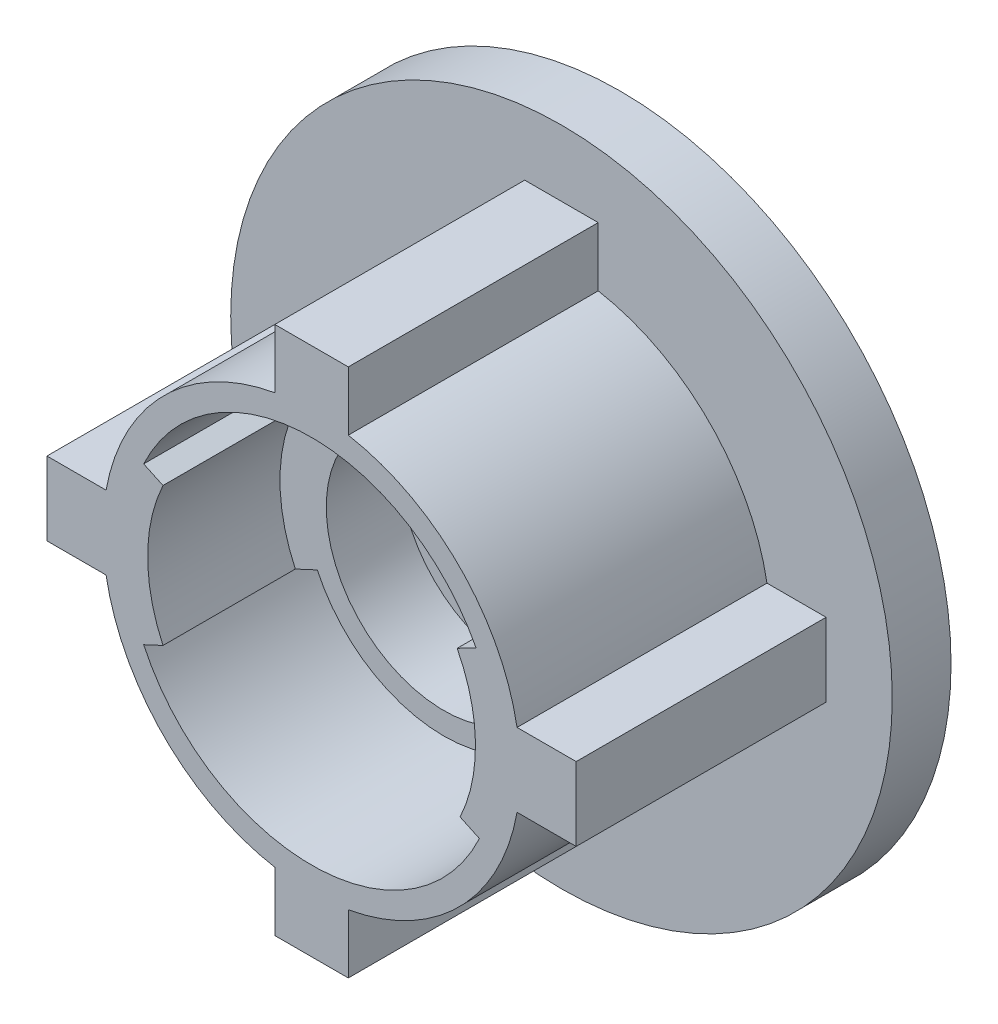
ISO-10303-21;
HEADER;
FILE_DESCRIPTION(('STEP AP214'),'2;1');
FILE_NAME('part.step','',(''),(''),'','','');
FILE_SCHEMA(('AUTOMOTIVE_DESIGN { 1 0 10303 214 1 1 1 1 }'));
ENDSEC;
DATA;
#1=APPLICATION_CONTEXT('core data for automotive mechanical design processes');
#2=APPLICATION_PROTOCOL_DEFINITION('international standard','automotive_design',2000,#1);
#3=PRODUCT_CONTEXT('',#1,'mechanical');
#4=PRODUCT('Part','Part','',(#3));
#5=PRODUCT_RELATED_PRODUCT_CATEGORY('part','',(#4));
#6=PRODUCT_DEFINITION_FORMATION('','',#4);
#7=PRODUCT_DEFINITION_CONTEXT('part definition',#1,'design');
#8=PRODUCT_DEFINITION('design','',#6,#7);
#9=PRODUCT_DEFINITION_SHAPE('','',#8);
#10=(LENGTH_UNIT() NAMED_UNIT(*) SI_UNIT(.MILLI.,.METRE.));
#11=(NAMED_UNIT(*) PLANE_ANGLE_UNIT() SI_UNIT($,.RADIAN.));
#12=(NAMED_UNIT(*) SI_UNIT($,.STERADIAN.) SOLID_ANGLE_UNIT());
#13=UNCERTAINTY_MEASURE_WITH_UNIT(LENGTH_MEASURE(1.E-05),#10,'distance_accuracy_value','');
#14=(GEOMETRIC_REPRESENTATION_CONTEXT(3) GLOBAL_UNCERTAINTY_ASSIGNED_CONTEXT((#13)) GLOBAL_UNIT_ASSIGNED_CONTEXT((#10,
#11,#12)) REPRESENTATION_CONTEXT('',''));
#15=CARTESIAN_POINT('',(0.,0.,0.));
#16=DIRECTION('',(0.,0.,1.));
#17=DIRECTION('',(1.,0.,0.));
#18=AXIS2_PLACEMENT_3D('',#15,#16,#17);
#19=CARTESIAN_POINT('',(0.,0.,7.));
#20=DIRECTION('',(0.,0.,1.));
#21=DIRECTION('',(1.,0.,0.));
#22=AXIS2_PLACEMENT_3D('',#19,#20,#21);
#23=CYLINDRICAL_SURFACE('',#22,8.);
#24=CARTESIAN_POINT('',(0.,0.,3.));
#25=DIRECTION('',(0.,0.,-1.));
#26=DIRECTION('',(-1.,0.,0.));
#27=AXIS2_PLACEMENT_3D('',#24,#25,#26);
#28=CIRCLE('',#27,8.);
#29=CARTESIAN_POINT('',(-8.,0.,3.));
#30=VERTEX_POINT('',#29);
#31=EDGE_CURVE('E409',#30,#30,#28,.T.);
#32=ORIENTED_EDGE('',*,*,#31,.T.);
#33=EDGE_LOOP('',(#32));
#34=FACE_BOUND('',#33,.T.);
#35=CARTESIAN_POINT('',(0.,0.,8.));
#36=DIRECTION('',(0.,0.,1.));
#37=DIRECTION('',(1.,0.,0.));
#38=AXIS2_PLACEMENT_3D('',#35,#36,#37);
#39=CIRCLE('',#38,8.);
#40=CARTESIAN_POINT('',(8.,0.,8.));
#41=VERTEX_POINT('',#40);
#42=EDGE_CURVE('E362',#41,#41,#39,.F.);
#43=ORIENTED_EDGE('',*,*,#42,.F.);
#44=EDGE_LOOP('',(#43));
#45=FACE_BOUND('',#44,.T.);
#46=ADVANCED_FACE('F49',(#34,#45),#23,.F.);
#47=CARTESIAN_POINT('',(0.,0.,8.));
#48=DIRECTION('',(0.,0.,1.));
#49=DIRECTION('',(1.,0.,0.));
#50=AXIS2_PLACEMENT_3D('',#47,#48,#49);
#51=CYLINDRICAL_SURFACE('',#50,9.5);
#52=CARTESIAN_POINT('',(0.,0.,8.));
#53=DIRECTION('',(0.,0.,1.));
#54=DIRECTION('',(1.,0.,0.));
#55=AXIS2_PLACEMENT_3D('',#52,#53,#54);
#56=CIRCLE('',#55,9.5);
#57=CARTESIAN_POINT('',(-8.60992397684817,-4.01487348653666,8.));
#58=VERTEX_POINT('',#57);
#59=CARTESIAN_POINT('',(8.60992397684817,-4.01487348653666,8.));
#60=VERTEX_POINT('',#59);
#61=EDGE_CURVE('E352',#58,#60,#56,.T.);
#62=ORIENTED_EDGE('',*,*,#61,.F.);
#63=DIRECTION('',(0.,0.,1.));
#64=VECTOR('',#63,1.);
#65=CARTESIAN_POINT('',(-8.60992397684817,-4.01487348653666,-24.1856365171545));
#66=LINE('',#65,#64);
#67=CARTESIAN_POINT('',(-8.60992397684817,-4.01487348653666,3.));
#68=VERTEX_POINT('',#67);
#69=EDGE_CURVE('E374',#68,#58,#66,.T.);
#70=ORIENTED_EDGE('',*,*,#69,.F.);
#71=CARTESIAN_POINT('',(0.,0.,3.));
#72=DIRECTION('',(0.,0.,-1.));
#73=DIRECTION('',(-1.,0.,0.));
#74=AXIS2_PLACEMENT_3D('',#71,#72,#73);
#75=CIRCLE('',#74,9.5);
#76=CARTESIAN_POINT('',(8.60992397684817,-4.01487348653666,3.));
#77=VERTEX_POINT('',#76);
#78=EDGE_CURVE('E517',#68,#77,#75,.F.);
#79=ORIENTED_EDGE('',*,*,#78,.T.);
#80=DIRECTION('',(0.,0.,1.));
#81=VECTOR('',#80,1.);
#82=CARTESIAN_POINT('',(8.60992397684817,-4.01487348653666,8.));
#83=LINE('',#82,#81);
#84=EDGE_CURVE('E406',#77,#60,#83,.T.);
#85=ORIENTED_EDGE('',*,*,#84,.T.);
#86=EDGE_LOOP('',(#62,#70,#79,#85));
#87=FACE_BOUND('',#86,.T.);
#88=ADVANCED_FACE('F533',(#87),#51,.T.);
#89=CARTESIAN_POINT('',(0.,0.,8.));
#90=DIRECTION('',(0.,0.,1.));
#91=DIRECTION('',(1.,0.,0.));
#92=AXIS2_PLACEMENT_3D('',#89,#90,#91);
#93=CYLINDRICAL_SURFACE('',#92,9.5);
#94=CARTESIAN_POINT('',(0.,0.,8.));
#95=DIRECTION('',(0.,0.,1.));
#96=DIRECTION('',(1.,0.,0.));
#97=AXIS2_PLACEMENT_3D('',#94,#95,#96);
#98=CIRCLE('',#97,9.5);
#99=CARTESIAN_POINT('',(8.43777370372536,4.36508590118464,8.));
#100=VERTEX_POINT('',#99);
#101=CARTESIAN_POINT('',(-8.60992397684817,4.01487348653666,8.));
#102=VERTEX_POINT('',#101);
#103=EDGE_CURVE('E358',#100,#102,#98,.T.);
#104=ORIENTED_EDGE('',*,*,#103,.F.);
#105=DIRECTION('',(0.,0.,1.));
#106=VECTOR('',#105,1.);
#107=CARTESIAN_POINT('',(8.43777370372536,4.36508590118464,8.));
#108=LINE('',#107,#106);
#109=CARTESIAN_POINT('',(8.43777370372536,4.36508590118464,3.));
#110=VERTEX_POINT('',#109);
#111=EDGE_CURVE('E410',#110,#100,#108,.T.);
#112=ORIENTED_EDGE('',*,*,#111,.F.);
#113=CARTESIAN_POINT('',(0.,0.,3.));
#114=DIRECTION('',(0.,0.,-1.));
#115=DIRECTION('',(-1.,0.,0.));
#116=AXIS2_PLACEMENT_3D('',#113,#114,#115);
#117=CIRCLE('',#116,9.5);
#118=CARTESIAN_POINT('',(-8.60992397684817,4.01487348653666,3.));
#119=VERTEX_POINT('',#118);
#120=EDGE_CURVE('E511',#110,#119,#117,.F.);
#121=ORIENTED_EDGE('',*,*,#120,.T.);
#122=DIRECTION('',(0.,0.,1.));
#123=VECTOR('',#122,1.);
#124=CARTESIAN_POINT('',(-8.60992397684817,4.01487348653666,8.));
#125=LINE('',#124,#123);
#126=EDGE_CURVE('E413',#119,#102,#125,.T.);
#127=ORIENTED_EDGE('',*,*,#126,.T.);
#128=EDGE_LOOP('',(#104,#112,#121,#127));
#129=FACE_BOUND('',#128,.T.);
#130=ADVANCED_FACE('F568',(#129),#93,.T.);
#131=CARTESIAN_POINT('',(-2.50000000000001,0.,15.));
#132=DIRECTION('',(1.,0.,0.));
#133=DIRECTION('',(0.,0.,-1.));
#134=AXIS2_PLACEMENT_3D('',#131,#132,#133);
#135=PLANE('',#134);
#136=DIRECTION('',(0.,0.,-1.));
#137=VECTOR('',#136,1.);
#138=CARTESIAN_POINT('',(-2.50000000000001,13.9781973086661,15.));
#139=LINE('',#138,#137);
#140=CARTESIAN_POINT('',(-2.5,13.9781973086661,17.));
#141=VERTEX_POINT('',#140);
#142=CARTESIAN_POINT('',(-2.50000000000001,13.9781973086661,0.));
#143=VERTEX_POINT('',#142);
#144=EDGE_CURVE('E495',#141,#143,#139,.T.);
#145=ORIENTED_EDGE('',*,*,#144,.F.);
#146=DIRECTION('',(0.,-1.,0.));
#147=VECTOR('',#146,1.);
#148=CARTESIAN_POINT('',(-2.50000000000001,0.,17.));
#149=LINE('',#148,#147);
#150=CARTESIAN_POINT('',(-2.50000000000001,18.,17.));
#151=VERTEX_POINT('',#150);
#152=EDGE_CURVE('E278',#151,#141,#149,.T.);
#153=ORIENTED_EDGE('',*,*,#152,.F.);
#154=DIRECTION('',(0.,0.,-1.));
#155=VECTOR('',#154,1.);
#156=CARTESIAN_POINT('',(-2.50000000000001,18.,15.));
#157=LINE('',#156,#155);
#158=CARTESIAN_POINT('',(-2.50000000000001,18.,0.));
#159=VERTEX_POINT('',#158);
#160=EDGE_CURVE('E270',#151,#159,#157,.T.);
#161=ORIENTED_EDGE('',*,*,#160,.T.);
#162=DIRECTION('',(0.,-1.,0.));
#163=VECTOR('',#162,1.);
#164=CARTESIAN_POINT('',(-2.50000000000001,0.,0.));
#165=LINE('',#164,#163);
#166=EDGE_CURVE('E424',#159,#143,#165,.T.);
#167=ORIENTED_EDGE('',*,*,#166,.T.);
#168=EDGE_LOOP('',(#145,#153,#161,#167));
#169=FACE_BOUND('',#168,.T.);
#170=ADVANCED_FACE('F666',(#169),#135,.F.);
#171=CARTESIAN_POINT('',(0.,0.,15.));
#172=DIRECTION('',(0.,0.,-1.));
#173=DIRECTION('',(-1.,0.,0.));
#174=AXIS2_PLACEMENT_3D('',#171,#172,#173);
#175=CYLINDRICAL_SURFACE('',#174,14.2);
#176=DIRECTION('',(0.,0.,-1.));
#177=VECTOR('',#176,1.);
#178=CARTESIAN_POINT('',(-13.9781973086661,2.49999999999995,15.));
#179=LINE('',#178,#177);
#180=CARTESIAN_POINT('',(-13.9781973086661,2.49999999999996,17.));
#181=VERTEX_POINT('',#180);
#182=CARTESIAN_POINT('',(-13.9781973086661,2.49999999999995,0.));
#183=VERTEX_POINT('',#182);
#184=EDGE_CURVE('E493',#181,#183,#179,.T.);
#185=ORIENTED_EDGE('',*,*,#184,.F.);
#186=CARTESIAN_POINT('',(0.,0.,17.));
#187=DIRECTION('',(0.,0.,1.));
#188=DIRECTION('',(1.,0.,0.));
#189=AXIS2_PLACEMENT_3D('',#186,#187,#188);
#190=CIRCLE('',#189,14.2);
#191=EDGE_CURVE('E289',#141,#181,#190,.T.);
#192=ORIENTED_EDGE('',*,*,#191,.F.);
#193=ORIENTED_EDGE('',*,*,#144,.T.);
#194=CARTESIAN_POINT('',(0.,0.,0.));
#195=DIRECTION('',(0.,0.,1.));
#196=DIRECTION('',(1.,0.,0.));
#197=AXIS2_PLACEMENT_3D('',#194,#195,#196);
#198=CIRCLE('',#197,14.2);
#199=EDGE_CURVE('E427',#143,#183,#198,.T.);
#200=ORIENTED_EDGE('',*,*,#199,.T.);
#201=EDGE_LOOP('',(#185,#192,#193,#200));
#202=FACE_BOUND('',#201,.T.);
#203=ADVANCED_FACE('F662',(#202),#175,.T.);
#204=CARTESIAN_POINT('',(0.,2.49999999999995,15.));
#205=DIRECTION('',(0.,-1.,0.));
#206=DIRECTION('',(0.,0.,-1.));
#207=AXIS2_PLACEMENT_3D('',#204,#205,#206);
#208=PLANE('',#207);
#209=DIRECTION('',(0.,0.,-1.));
#210=VECTOR('',#209,1.);
#211=CARTESIAN_POINT('',(-18.,2.49999999999995,15.));
#212=LINE('',#211,#210);
#213=CARTESIAN_POINT('',(-18.,2.49999999999995,17.));
#214=VERTEX_POINT('',#213);
#215=CARTESIAN_POINT('',(-18.,2.49999999999995,0.));
#216=VERTEX_POINT('',#215);
#217=EDGE_CURVE('E491',#214,#216,#212,.T.);
#218=ORIENTED_EDGE('',*,*,#217,.F.);
#219=DIRECTION('',(-1.,0.,0.));
#220=VECTOR('',#219,1.);
#221=CARTESIAN_POINT('',(0.,2.49999999999997,17.));
#222=LINE('',#221,#220);
#223=EDGE_CURVE('E292',#181,#214,#222,.T.);
#224=ORIENTED_EDGE('',*,*,#223,.F.);
#225=ORIENTED_EDGE('',*,*,#184,.T.);
#226=DIRECTION('',(-1.,0.,0.));
#227=VECTOR('',#226,1.);
#228=CARTESIAN_POINT('',(0.,2.49999999999995,0.));
#229=LINE('',#228,#227);
#230=EDGE_CURVE('E430',#183,#216,#229,.T.);
#231=ORIENTED_EDGE('',*,*,#230,.T.);
#232=EDGE_LOOP('',(#218,#224,#225,#231));
#233=FACE_BOUND('',#232,.T.);
#234=ADVANCED_FACE('F658',(#233),#208,.F.);
#235=CARTESIAN_POINT('',(-18.,0.,15.));
#236=DIRECTION('',(1.,0.,0.));
#237=DIRECTION('',(0.,0.,-1.));
#238=AXIS2_PLACEMENT_3D('',#235,#236,#237);
#239=PLANE('',#238);
#240=DIRECTION('',(0.,0.,-1.));
#241=VECTOR('',#240,1.);
#242=CARTESIAN_POINT('',(-18.,-2.5,15.));
#243=LINE('',#242,#241);
#244=CARTESIAN_POINT('',(-18.,-2.5,17.));
#245=VERTEX_POINT('',#244);
#246=CARTESIAN_POINT('',(-18.,-2.5,0.));
#247=VERTEX_POINT('',#246);
#248=EDGE_CURVE('E489',#245,#247,#243,.T.);
#249=ORIENTED_EDGE('',*,*,#248,.F.);
#250=DIRECTION('',(0.,-1.,0.));
#251=VECTOR('',#250,1.);
#252=CARTESIAN_POINT('',(-18.,0.,17.));
#253=LINE('',#252,#251);
#254=EDGE_CURVE('E295',#214,#245,#253,.T.);
#255=ORIENTED_EDGE('',*,*,#254,.F.);
#256=ORIENTED_EDGE('',*,*,#217,.T.);
#257=DIRECTION('',(0.,-1.,0.));
#258=VECTOR('',#257,1.);
#259=CARTESIAN_POINT('',(-18.,0.,0.));
#260=LINE('',#259,#258);
#261=EDGE_CURVE('E433',#216,#247,#260,.T.);
#262=ORIENTED_EDGE('',*,*,#261,.T.);
#263=EDGE_LOOP('',(#249,#255,#256,#262));
#264=FACE_BOUND('',#263,.T.);
#265=ADVANCED_FACE('F654',(#264),#239,.F.);
#266=CARTESIAN_POINT('',(0.,-2.5,15.));
#267=DIRECTION('',(0.,1.,0.));
#268=DIRECTION('',(0.,0.,1.));
#269=AXIS2_PLACEMENT_3D('',#266,#267,#268);
#270=PLANE('',#269);
#271=DIRECTION('',(0.,0.,-1.));
#272=VECTOR('',#271,1.);
#273=CARTESIAN_POINT('',(-13.9781973086661,-2.5,15.));
#274=LINE('',#273,#272);
#275=CARTESIAN_POINT('',(-13.9781973086661,-2.5,17.));
#276=VERTEX_POINT('',#275);
#277=CARTESIAN_POINT('',(-13.9781973086661,-2.5,0.));
#278=VERTEX_POINT('',#277);
#279=EDGE_CURVE('E487',#276,#278,#274,.T.);
#280=ORIENTED_EDGE('',*,*,#279,.F.);
#281=DIRECTION('',(1.,0.,0.));
#282=VECTOR('',#281,1.);
#283=CARTESIAN_POINT('',(0.,-2.5,17.));
#284=LINE('',#283,#282);
#285=EDGE_CURVE('E298',#245,#276,#284,.T.);
#286=ORIENTED_EDGE('',*,*,#285,.F.);
#287=ORIENTED_EDGE('',*,*,#248,.T.);
#288=DIRECTION('',(1.,0.,0.));
#289=VECTOR('',#288,1.);
#290=CARTESIAN_POINT('',(0.,-2.5,0.));
#291=LINE('',#290,#289);
#292=EDGE_CURVE('E436',#247,#278,#291,.T.);
#293=ORIENTED_EDGE('',*,*,#292,.T.);
#294=EDGE_LOOP('',(#280,#286,#287,#293));
#295=FACE_BOUND('',#294,.T.);
#296=ADVANCED_FACE('F650',(#295),#270,.F.);
#297=CARTESIAN_POINT('',(0.,0.,15.));
#298=DIRECTION('',(0.,0.,-1.));
#299=DIRECTION('',(-1.,0.,0.));
#300=AXIS2_PLACEMENT_3D('',#297,#298,#299);
#301=CYLINDRICAL_SURFACE('',#300,14.2);
#302=DIRECTION('',(0.,0.,-1.));
#303=VECTOR('',#302,1.);
#304=CARTESIAN_POINT('',(-2.5,-13.9781973086661,15.));
#305=LINE('',#304,#303);
#306=CARTESIAN_POINT('',(-2.50000000000001,-13.9781973086661,17.));
#307=VERTEX_POINT('',#306);
#308=CARTESIAN_POINT('',(-2.5,-13.9781973086661,0.));
#309=VERTEX_POINT('',#308);
#310=EDGE_CURVE('E485',#307,#309,#305,.T.);
#311=ORIENTED_EDGE('',*,*,#310,.F.);
#312=CARTESIAN_POINT('',(0.,0.,17.));
#313=DIRECTION('',(0.,0.,1.));
#314=DIRECTION('',(1.,0.,0.));
#315=AXIS2_PLACEMENT_3D('',#312,#313,#314);
#316=CIRCLE('',#315,14.2);
#317=EDGE_CURVE('E301',#276,#307,#316,.T.);
#318=ORIENTED_EDGE('',*,*,#317,.F.);
#319=ORIENTED_EDGE('',*,*,#279,.T.);
#320=CARTESIAN_POINT('',(0.,0.,0.));
#321=DIRECTION('',(0.,0.,1.));
#322=DIRECTION('',(1.,0.,0.));
#323=AXIS2_PLACEMENT_3D('',#320,#321,#322);
#324=CIRCLE('',#323,14.2);
#325=EDGE_CURVE('E439',#278,#309,#324,.T.);
#326=ORIENTED_EDGE('',*,*,#325,.T.);
#327=EDGE_LOOP('',(#311,#318,#319,#326));
#328=FACE_BOUND('',#327,.T.);
#329=ADVANCED_FACE('F646',(#328),#301,.T.);
#330=CARTESIAN_POINT('',(-2.5,0.,15.));
#331=DIRECTION('',(1.,0.,0.));
#332=DIRECTION('',(0.,0.,-1.));
#333=AXIS2_PLACEMENT_3D('',#330,#331,#332);
#334=PLANE('',#333);
#335=DIRECTION('',(0.,0.,-1.));
#336=VECTOR('',#335,1.);
#337=CARTESIAN_POINT('',(-2.5,-18.,15.));
#338=LINE('',#337,#336);
#339=CARTESIAN_POINT('',(-2.5,-18.,17.));
#340=VERTEX_POINT('',#339);
#341=CARTESIAN_POINT('',(-2.5,-18.,0.));
#342=VERTEX_POINT('',#341);
#343=EDGE_CURVE('E483',#340,#342,#338,.T.);
#344=ORIENTED_EDGE('',*,*,#343,.F.);
#345=DIRECTION('',(0.,-1.,0.));
#346=VECTOR('',#345,1.);
#347=CARTESIAN_POINT('',(-2.50000000000003,0.,17.));
#348=LINE('',#347,#346);
#349=EDGE_CURVE('E304',#307,#340,#348,.T.);
#350=ORIENTED_EDGE('',*,*,#349,.F.);
#351=ORIENTED_EDGE('',*,*,#310,.T.);
#352=DIRECTION('',(0.,-1.,0.));
#353=VECTOR('',#352,1.);
#354=CARTESIAN_POINT('',(-2.5,0.,0.));
#355=LINE('',#354,#353);
#356=EDGE_CURVE('E442',#309,#342,#355,.T.);
#357=ORIENTED_EDGE('',*,*,#356,.T.);
#358=EDGE_LOOP('',(#344,#350,#351,#357));
#359=FACE_BOUND('',#358,.T.);
#360=ADVANCED_FACE('F642',(#359),#334,.F.);
#361=CARTESIAN_POINT('',(0.,-18.,15.));
#362=DIRECTION('',(0.,1.,0.));
#363=DIRECTION('',(0.,0.,1.));
#364=AXIS2_PLACEMENT_3D('',#361,#362,#363);
#365=PLANE('',#364);
#366=DIRECTION('',(0.,0.,-1.));
#367=VECTOR('',#366,1.);
#368=CARTESIAN_POINT('',(2.5,-18.,15.));
#369=LINE('',#368,#367);
#370=CARTESIAN_POINT('',(2.5,-18.,17.));
#371=VERTEX_POINT('',#370);
#372=CARTESIAN_POINT('',(2.5,-18.,0.));
#373=VERTEX_POINT('',#372);
#374=EDGE_CURVE('E481',#371,#373,#369,.T.);
#375=ORIENTED_EDGE('',*,*,#374,.F.);
#376=DIRECTION('',(1.,0.,0.));
#377=VECTOR('',#376,1.);
#378=CARTESIAN_POINT('',(0.,-18.,17.));
#379=LINE('',#378,#377);
#380=EDGE_CURVE('E307',#340,#371,#379,.T.);
#381=ORIENTED_EDGE('',*,*,#380,.F.);
#382=ORIENTED_EDGE('',*,*,#343,.T.);
#383=DIRECTION('',(1.,0.,0.));
#384=VECTOR('',#383,1.);
#385=CARTESIAN_POINT('',(0.,-18.,0.));
#386=LINE('',#385,#384);
#387=EDGE_CURVE('E445',#342,#373,#386,.T.);
#388=ORIENTED_EDGE('',*,*,#387,.T.);
#389=EDGE_LOOP('',(#375,#381,#382,#388));
#390=FACE_BOUND('',#389,.T.);
#391=ADVANCED_FACE('F638',(#390),#365,.F.);
#392=CARTESIAN_POINT('',(2.5,0.,15.));
#393=DIRECTION('',(-1.,0.,0.));
#394=DIRECTION('',(0.,0.,1.));
#395=AXIS2_PLACEMENT_3D('',#392,#393,#394);
#396=PLANE('',#395);
#397=DIRECTION('',(0.,0.,-1.));
#398=VECTOR('',#397,1.);
#399=CARTESIAN_POINT('',(2.5,-13.9781973086661,15.));
#400=LINE('',#399,#398);
#401=CARTESIAN_POINT('',(2.5,-13.9781973086661,17.));
#402=VERTEX_POINT('',#401);
#403=CARTESIAN_POINT('',(2.5,-13.9781973086661,0.));
#404=VERTEX_POINT('',#403);
#405=EDGE_CURVE('E479',#402,#404,#400,.T.);
#406=ORIENTED_EDGE('',*,*,#405,.F.);
#407=DIRECTION('',(0.,1.,0.));
#408=VECTOR('',#407,1.);
#409=CARTESIAN_POINT('',(2.5,0.,17.));
#410=LINE('',#409,#408);
#411=EDGE_CURVE('E310',#371,#402,#410,.T.);
#412=ORIENTED_EDGE('',*,*,#411,.F.);
#413=ORIENTED_EDGE('',*,*,#374,.T.);
#414=DIRECTION('',(0.,1.,0.));
#415=VECTOR('',#414,1.);
#416=CARTESIAN_POINT('',(2.5,0.,0.));
#417=LINE('',#416,#415);
#418=EDGE_CURVE('E448',#373,#404,#417,.T.);
#419=ORIENTED_EDGE('',*,*,#418,.T.);
#420=EDGE_LOOP('',(#406,#412,#413,#419));
#421=FACE_BOUND('',#420,.T.);
#422=ADVANCED_FACE('F634',(#421),#396,.F.);
#423=CARTESIAN_POINT('',(0.,0.,15.));
#424=DIRECTION('',(0.,0.,-1.));
#425=DIRECTION('',(-1.,0.,0.));
#426=AXIS2_PLACEMENT_3D('',#423,#424,#425);
#427=CYLINDRICAL_SURFACE('',#426,14.2);
#428=DIRECTION('',(0.,0.,-1.));
#429=VECTOR('',#428,1.);
#430=CARTESIAN_POINT('',(13.9781973086661,-2.49999999999995,15.));
#431=LINE('',#430,#429);
#432=CARTESIAN_POINT('',(13.9781973086661,-2.49999999999995,17.));
#433=VERTEX_POINT('',#432);
#434=CARTESIAN_POINT('',(13.9781973086661,-2.49999999999995,0.));
#435=VERTEX_POINT('',#434);
#436=EDGE_CURVE('E477',#433,#435,#431,.T.);
#437=ORIENTED_EDGE('',*,*,#436,.F.);
#438=CARTESIAN_POINT('',(0.,0.,17.));
#439=DIRECTION('',(0.,0.,1.));
#440=DIRECTION('',(1.,0.,0.));
#441=AXIS2_PLACEMENT_3D('',#438,#439,#440);
#442=CIRCLE('',#441,14.2);
#443=EDGE_CURVE('E313',#402,#433,#442,.T.);
#444=ORIENTED_EDGE('',*,*,#443,.F.);
#445=ORIENTED_EDGE('',*,*,#405,.T.);
#446=CARTESIAN_POINT('',(0.,0.,0.));
#447=DIRECTION('',(0.,0.,1.));
#448=DIRECTION('',(1.,0.,0.));
#449=AXIS2_PLACEMENT_3D('',#446,#447,#448);
#450=CIRCLE('',#449,14.2);
#451=EDGE_CURVE('E451',#404,#435,#450,.T.);
#452=ORIENTED_EDGE('',*,*,#451,.T.);
#453=EDGE_LOOP('',(#437,#444,#445,#452));
#454=FACE_BOUND('',#453,.T.);
#455=ADVANCED_FACE('F630',(#454),#427,.T.);
#456=CARTESIAN_POINT('',(0.,-2.49999999999995,15.));
#457=DIRECTION('',(0.,1.,0.));
#458=DIRECTION('',(0.,0.,1.));
#459=AXIS2_PLACEMENT_3D('',#456,#457,#458);
#460=PLANE('',#459);
#461=DIRECTION('',(0.,0.,-1.));
#462=VECTOR('',#461,1.);
#463=CARTESIAN_POINT('',(18.,-2.49999999999995,15.));
#464=LINE('',#463,#462);
#465=CARTESIAN_POINT('',(18.,-2.49999999999995,17.));
#466=VERTEX_POINT('',#465);
#467=CARTESIAN_POINT('',(18.,-2.49999999999995,0.));
#468=VERTEX_POINT('',#467);
#469=EDGE_CURVE('E475',#466,#468,#464,.T.);
#470=ORIENTED_EDGE('',*,*,#469,.F.);
#471=DIRECTION('',(1.,0.,0.));
#472=VECTOR('',#471,1.);
#473=CARTESIAN_POINT('',(0.,-2.49999999999994,17.));
#474=LINE('',#473,#472);
#475=EDGE_CURVE('E316',#433,#466,#474,.T.);
#476=ORIENTED_EDGE('',*,*,#475,.F.);
#477=ORIENTED_EDGE('',*,*,#436,.T.);
#478=DIRECTION('',(1.,0.,0.));
#479=VECTOR('',#478,1.);
#480=CARTESIAN_POINT('',(0.,-2.49999999999995,0.));
#481=LINE('',#480,#479);
#482=EDGE_CURVE('E454',#435,#468,#481,.T.);
#483=ORIENTED_EDGE('',*,*,#482,.T.);
#484=EDGE_LOOP('',(#470,#476,#477,#483));
#485=FACE_BOUND('',#484,.T.);
#486=ADVANCED_FACE('F626',(#485),#460,.F.);
#487=CARTESIAN_POINT('',(18.,0.,15.));
#488=DIRECTION('',(-1.,0.,0.));
#489=DIRECTION('',(0.,0.,1.));
#490=AXIS2_PLACEMENT_3D('',#487,#488,#489);
#491=PLANE('',#490);
#492=DIRECTION('',(0.,0.,-1.));
#493=VECTOR('',#492,1.);
#494=CARTESIAN_POINT('',(18.,2.5,15.));
#495=LINE('',#494,#493);
#496=CARTESIAN_POINT('',(18.,2.5,17.));
#497=VERTEX_POINT('',#496);
#498=CARTESIAN_POINT('',(18.,2.5,0.));
#499=VERTEX_POINT('',#498);
#500=EDGE_CURVE('E473',#497,#499,#495,.T.);
#501=ORIENTED_EDGE('',*,*,#500,.F.);
#502=DIRECTION('',(0.,1.,0.));
#503=VECTOR('',#502,1.);
#504=CARTESIAN_POINT('',(18.,0.,17.));
#505=LINE('',#504,#503);
#506=EDGE_CURVE('E319',#466,#497,#505,.T.);
#507=ORIENTED_EDGE('',*,*,#506,.F.);
#508=ORIENTED_EDGE('',*,*,#469,.T.);
#509=DIRECTION('',(0.,1.,0.));
#510=VECTOR('',#509,1.);
#511=CARTESIAN_POINT('',(18.,0.,0.));
#512=LINE('',#511,#510);
#513=EDGE_CURVE('E457',#468,#499,#512,.T.);
#514=ORIENTED_EDGE('',*,*,#513,.T.);
#515=EDGE_LOOP('',(#501,#507,#508,#514));
#516=FACE_BOUND('',#515,.T.);
#517=ADVANCED_FACE('F622',(#516),#491,.F.);
#518=CARTESIAN_POINT('',(0.,2.5,15.));
#519=DIRECTION('',(0.,-1.,0.));
#520=DIRECTION('',(0.,0.,-1.));
#521=AXIS2_PLACEMENT_3D('',#518,#519,#520);
#522=PLANE('',#521);
#523=DIRECTION('',(0.,0.,-1.));
#524=VECTOR('',#523,1.);
#525=CARTESIAN_POINT('',(13.9781973086661,2.5,15.));
#526=LINE('',#525,#524);
#527=CARTESIAN_POINT('',(13.9781973086661,2.5,17.));
#528=VERTEX_POINT('',#527);
#529=CARTESIAN_POINT('',(13.9781973086661,2.5,0.));
#530=VERTEX_POINT('',#529);
#531=EDGE_CURVE('E471',#528,#530,#526,.T.);
#532=ORIENTED_EDGE('',*,*,#531,.F.);
#533=DIRECTION('',(-1.,0.,0.));
#534=VECTOR('',#533,1.);
#535=CARTESIAN_POINT('',(0.,2.5,17.));
#536=LINE('',#535,#534);
#537=EDGE_CURVE('E322',#497,#528,#536,.T.);
#538=ORIENTED_EDGE('',*,*,#537,.F.);
#539=ORIENTED_EDGE('',*,*,#500,.T.);
#540=DIRECTION('',(-1.,0.,0.));
#541=VECTOR('',#540,1.);
#542=CARTESIAN_POINT('',(0.,2.5,0.));
#543=LINE('',#542,#541);
#544=EDGE_CURVE('E460',#499,#530,#543,.T.);
#545=ORIENTED_EDGE('',*,*,#544,.T.);
#546=EDGE_LOOP('',(#532,#538,#539,#545));
#547=FACE_BOUND('',#546,.T.);
#548=ADVANCED_FACE('F618',(#547),#522,.F.);
#549=CARTESIAN_POINT('',(0.,0.,15.));
#550=DIRECTION('',(0.,0.,-1.));
#551=DIRECTION('',(-1.,0.,0.));
#552=AXIS2_PLACEMENT_3D('',#549,#550,#551);
#553=CYLINDRICAL_SURFACE('',#552,14.2);
#554=DIRECTION('',(0.,0.,-1.));
#555=VECTOR('',#554,1.);
#556=CARTESIAN_POINT('',(2.5,13.9781973086661,15.));
#557=LINE('',#556,#555);
#558=CARTESIAN_POINT('',(2.5,13.9781973086661,17.));
#559=VERTEX_POINT('',#558);
#560=CARTESIAN_POINT('',(2.5,13.9781973086661,0.));
#561=VERTEX_POINT('',#560);
#562=EDGE_CURVE('E269',#559,#561,#557,.T.);
#563=ORIENTED_EDGE('',*,*,#562,.F.);
#564=CARTESIAN_POINT('',(0.,0.,17.));
#565=DIRECTION('',(0.,0.,1.));
#566=DIRECTION('',(1.,0.,0.));
#567=AXIS2_PLACEMENT_3D('',#564,#565,#566);
#568=CIRCLE('',#567,14.2);
#569=EDGE_CURVE('E285',#528,#559,#568,.T.);
#570=ORIENTED_EDGE('',*,*,#569,.F.);
#571=ORIENTED_EDGE('',*,*,#531,.T.);
#572=CARTESIAN_POINT('',(0.,0.,0.));
#573=DIRECTION('',(0.,0.,1.));
#574=DIRECTION('',(1.,0.,0.));
#575=AXIS2_PLACEMENT_3D('',#572,#573,#574);
#576=CIRCLE('',#575,14.2);
#577=EDGE_CURVE('E463',#530,#561,#576,.T.);
#578=ORIENTED_EDGE('',*,*,#577,.T.);
#579=EDGE_LOOP('',(#563,#570,#571,#578));
#580=FACE_BOUND('',#579,.T.);
#581=ADVANCED_FACE('F615',(#580),#553,.T.);
#582=CARTESIAN_POINT('',(2.5,0.,15.));
#583=DIRECTION('',(-1.,0.,0.));
#584=DIRECTION('',(0.,0.,1.));
#585=AXIS2_PLACEMENT_3D('',#582,#583,#584);
#586=PLANE('',#585);
#587=DIRECTION('',(0.,0.,-1.));
#588=VECTOR('',#587,1.);
#589=CARTESIAN_POINT('',(2.5,18.,15.));
#590=LINE('',#589,#588);
#591=CARTESIAN_POINT('',(2.5,18.,17.));
#592=VERTEX_POINT('',#591);
#593=CARTESIAN_POINT('',(2.5,18.,0.));
#594=VERTEX_POINT('',#593);
#595=EDGE_CURVE('E259',#592,#594,#590,.T.);
#596=ORIENTED_EDGE('',*,*,#595,.F.);
#597=DIRECTION('',(0.,1.,0.));
#598=VECTOR('',#597,1.);
#599=CARTESIAN_POINT('',(2.50000000000001,0.,17.));
#600=LINE('',#599,#598);
#601=EDGE_CURVE('E263',#559,#592,#600,.T.);
#602=ORIENTED_EDGE('',*,*,#601,.F.);
#603=ORIENTED_EDGE('',*,*,#562,.T.);
#604=DIRECTION('',(0.,1.,0.));
#605=VECTOR('',#604,1.);
#606=CARTESIAN_POINT('',(2.5,0.,0.));
#607=LINE('',#606,#605);
#608=EDGE_CURVE('E265',#561,#594,#607,.T.);
#609=ORIENTED_EDGE('',*,*,#608,.T.);
#610=EDGE_LOOP('',(#596,#602,#603,#609));
#611=FACE_BOUND('',#610,.T.);
#612=ADVANCED_FACE('F261',(#611),#586,.F.);
#613=CARTESIAN_POINT('',(0.,18.,15.));
#614=DIRECTION('',(0.,-1.,0.));
#615=DIRECTION('',(0.,0.,-1.));
#616=AXIS2_PLACEMENT_3D('',#613,#614,#615);
#617=PLANE('',#616);
#618=ORIENTED_EDGE('',*,*,#160,.F.);
#619=DIRECTION('',(-1.,0.,0.));
#620=VECTOR('',#619,1.);
#621=CARTESIAN_POINT('',(0.,18.,17.));
#622=LINE('',#621,#620);
#623=EDGE_CURVE('E273',#592,#151,#622,.T.);
#624=ORIENTED_EDGE('',*,*,#623,.F.);
#625=ORIENTED_EDGE('',*,*,#595,.T.);
#626=DIRECTION('',(-1.,0.,0.));
#627=VECTOR('',#626,1.);
#628=CARTESIAN_POINT('',(0.,18.,0.));
#629=LINE('',#628,#627);
#630=EDGE_CURVE('E467',#594,#159,#629,.T.);
#631=ORIENTED_EDGE('',*,*,#630,.T.);
#632=EDGE_LOOP('',(#618,#624,#625,#631));
#633=FACE_BOUND('',#632,.T.);
#634=ADVANCED_FACE('F274',(#633),#617,.F.);
#635=CARTESIAN_POINT('',(0.,0.,8.));
#636=DIRECTION('',(0.,0.,1.));
#637=DIRECTION('',(1.,0.,0.));
#638=AXIS2_PLACEMENT_3D('',#635,#636,#637);
#639=CYLINDRICAL_SURFACE('',#638,12.6);
#640=DIRECTION('',(0.,0.,1.));
#641=VECTOR('',#640,1.);
#642=CARTESIAN_POINT('',(-11.4194781166618,-5.32499009793283,-24.1856365171545));
#643=LINE('',#642,#641);
#644=CARTESIAN_POINT('',(-11.4194781166618,-5.32499009793283,0.));
#645=VERTEX_POINT('',#644);
#646=CARTESIAN_POINT('',(-11.4194781166618,-5.32499009793283,17.));
#647=VERTEX_POINT('',#646);
#648=EDGE_CURVE('E373',#645,#647,#643,.T.);
#649=ORIENTED_EDGE('',*,*,#648,.T.);
#650=CARTESIAN_POINT('',(0.,0.,17.));
#651=DIRECTION('',(0.,0.,1.));
#652=DIRECTION('',(1.,0.,0.));
#653=AXIS2_PLACEMENT_3D('',#650,#651,#652);
#654=CIRCLE('',#653,12.6);
#655=CARTESIAN_POINT('',(11.4194781166618,-5.32499009793283,17.));
#656=VERTEX_POINT('',#655);
#657=EDGE_CURVE('E346',#656,#647,#654,.F.);
#658=ORIENTED_EDGE('',*,*,#657,.F.);
#659=DIRECTION('',(0.,0.,1.));
#660=VECTOR('',#659,1.);
#661=CARTESIAN_POINT('',(11.4194781166618,-5.32499009793283,8.));
#662=LINE('',#661,#660);
#663=CARTESIAN_POINT('',(11.4194781166618,-5.32499009793283,0.));
#664=VERTEX_POINT('',#663);
#665=EDGE_CURVE('E418',#664,#656,#662,.T.);
#666=ORIENTED_EDGE('',*,*,#665,.F.);
#667=CARTESIAN_POINT('',(0.,0.,0.));
#668=DIRECTION('',(0.,0.,-1.));
#669=DIRECTION('',(-1.,0.,0.));
#670=AXIS2_PLACEMENT_3D('',#667,#668,#669);
#671=CIRCLE('',#670,12.6);
#672=EDGE_CURVE('E390',#645,#664,#671,.F.);
#673=ORIENTED_EDGE('',*,*,#672,.F.);
#674=EDGE_LOOP('',(#649,#658,#666,#673));
#675=FACE_BOUND('',#674,.T.);
#676=ADVANCED_FACE('F580',(#675),#639,.F.);
#677=CARTESIAN_POINT('',(8.60992397684817,-4.01487348653666,8.));
#678=DIRECTION('',(0.422618261740701,0.906307787036649,0.));
#679=DIRECTION('',(-0.906307787036649,0.422618261740701,0.));
#680=AXIS2_PLACEMENT_3D('',#677,#678,#679);
#681=PLANE('',#680);
#682=ORIENTED_EDGE('',*,*,#665,.T.);
#683=DIRECTION('',(0.906307787036649,-0.422618261740701,0.));
#684=VECTOR('',#683,1.);
#685=CARTESIAN_POINT('',(0.,0.,17.));
#686=LINE('',#685,#684);
#687=CARTESIAN_POINT('',(10.1053318254586,-4.71219361840881,17.));
#688=VERTEX_POINT('',#687);
#689=EDGE_CURVE('E343',#688,#656,#686,.T.);
#690=ORIENTED_EDGE('',*,*,#689,.F.);
#691=DIRECTION('',(0.,0.,1.));
#692=VECTOR('',#691,1.);
#693=CARTESIAN_POINT('',(10.1053318254586,-4.71219361840881,8.));
#694=LINE('',#693,#692);
#695=CARTESIAN_POINT('',(10.1053318254586,-4.71219361840881,8.));
#696=VERTEX_POINT('',#695);
#697=EDGE_CURVE('E370',#688,#696,#694,.F.);
#698=ORIENTED_EDGE('',*,*,#697,.T.);
#699=DIRECTION('',(0.906307787036649,-0.422618261740701,0.));
#700=VECTOR('',#699,1.);
#701=CARTESIAN_POINT('',(8.60992397684817,-4.01487348653666,8.));
#702=LINE('',#701,#700);
#703=EDGE_CURVE('E354',#60,#696,#702,.T.);
#704=ORIENTED_EDGE('',*,*,#703,.F.);
#705=ORIENTED_EDGE('',*,*,#84,.F.);
#706=DIRECTION('',(0.906307787036649,-0.422618261740701,0.));
#707=VECTOR('',#706,1.);
#708=CARTESIAN_POINT('',(0.,0.,3.));
#709=LINE('',#708,#707);
#710=CARTESIAN_POINT('',(10.1053318254586,-4.71219361840881,3.));
#711=VERTEX_POINT('',#710);
#712=EDGE_CURVE('E520',#77,#711,#709,.T.);
#713=ORIENTED_EDGE('',*,*,#712,.T.);
#714=DIRECTION('',(0.,0.,1.));
#715=VECTOR('',#714,1.);
#716=CARTESIAN_POINT('',(10.1053318254586,-4.71219361840881,-44.1636651713959));
#717=LINE('',#716,#715);
#718=CARTESIAN_POINT('',(10.1053318254586,-4.71219361840881,0.));
#719=VERTEX_POINT('',#718);
#720=EDGE_CURVE('E404',#711,#719,#717,.F.);
#721=ORIENTED_EDGE('',*,*,#720,.T.);
#722=DIRECTION('',(-0.906307787036649,0.422618261740701,0.));
#723=VECTOR('',#722,1.);
#724=CARTESIAN_POINT('',(11.4194781166618,-5.32499009793283,0.));
#725=LINE('',#724,#723);
#726=EDGE_CURVE('E387',#664,#719,#725,.T.);
#727=ORIENTED_EDGE('',*,*,#726,.F.);
#728=EDGE_LOOP('',(#682,#690,#698,#704,#705,#713,#721,#727));
#729=FACE_BOUND('',#728,.T.);
#730=ADVANCED_FACE('F575',(#729),#681,.F.);
#731=CARTESIAN_POINT('',(0.,0.,8.));
#732=DIRECTION('',(0.,0.,1.));
#733=DIRECTION('',(1.,0.,0.));
#734=AXIS2_PLACEMENT_3D('',#731,#732,#733);
#735=CYLINDRICAL_SURFACE('',#734,12.6);
#736=DIRECTION('',(0.,0.,1.));
#737=VECTOR('',#736,1.);
#738=CARTESIAN_POINT('',(11.1911524912568,5.78948235315015,8.));
#739=LINE('',#738,#737);
#740=CARTESIAN_POINT('',(11.1911524912568,5.78948235315015,0.));
#741=VERTEX_POINT('',#740);
#742=CARTESIAN_POINT('',(11.1911524912568,5.78948235315015,17.));
#743=VERTEX_POINT('',#742);
#744=EDGE_CURVE('E407',#741,#743,#739,.T.);
#745=ORIENTED_EDGE('',*,*,#744,.T.);
#746=CARTESIAN_POINT('',(0.,0.,17.));
#747=DIRECTION('',(0.,0.,1.));
#748=DIRECTION('',(1.,0.,0.));
#749=AXIS2_PLACEMENT_3D('',#746,#747,#748);
#750=CIRCLE('',#749,12.6);
#751=CARTESIAN_POINT('',(-11.4194781166618,5.32499009793282,17.));
#752=VERTEX_POINT('',#751);
#753=EDGE_CURVE('E334',#752,#743,#750,.F.);
#754=ORIENTED_EDGE('',*,*,#753,.F.);
#755=DIRECTION('',(0.,0.,1.));
#756=VECTOR('',#755,1.);
#757=CARTESIAN_POINT('',(-11.4194781166618,5.32499009793283,8.));
#758=LINE('',#757,#756);
#759=CARTESIAN_POINT('',(-11.4194781166618,5.32499009793283,0.));
#760=VERTEX_POINT('',#759);
#761=EDGE_CURVE('E416',#760,#752,#758,.T.);
#762=ORIENTED_EDGE('',*,*,#761,.F.);
#763=CARTESIAN_POINT('',(0.,0.,0.));
#764=DIRECTION('',(0.,0.,-1.));
#765=DIRECTION('',(-1.,0.,0.));
#766=AXIS2_PLACEMENT_3D('',#763,#764,#765);
#767=CIRCLE('',#766,12.6);
#768=EDGE_CURVE('E386',#741,#760,#767,.F.);
#769=ORIENTED_EDGE('',*,*,#768,.F.);
#770=EDGE_LOOP('',(#745,#754,#762,#769));
#771=FACE_BOUND('',#770,.T.);
#772=ADVANCED_FACE('F557',(#771),#735,.F.);
#773=CARTESIAN_POINT('',(8.43777370372536,4.36508590118464,8.));
#774=DIRECTION('',(0.459482726440487,-0.888186705655301,0.));
#775=DIRECTION('',(0.888186705655301,0.459482726440487,0.));
#776=AXIS2_PLACEMENT_3D('',#773,#774,#775);
#777=PLANE('',#776);
#778=DIRECTION('',(-0.888186705655301,-0.459482726440487,0.));
#779=VECTOR('',#778,1.);
#780=CARTESIAN_POINT('',(8.43777370372536,4.36508590118464,8.));
#781=LINE('',#780,#779);
#782=CARTESIAN_POINT('',(9.90328176805661,5.12323239981144,8.));
#783=VERTEX_POINT('',#782);
#784=EDGE_CURVE('E360',#783,#100,#781,.T.);
#785=ORIENTED_EDGE('',*,*,#784,.F.);
#786=DIRECTION('',(0.,0.,1.));
#787=VECTOR('',#786,1.);
#788=CARTESIAN_POINT('',(9.90328176805661,5.12323239981144,8.));
#789=LINE('',#788,#787);
#790=CARTESIAN_POINT('',(9.90328176805661,5.12323239981144,17.));
#791=VERTEX_POINT('',#790);
#792=EDGE_CURVE('E368',#783,#791,#789,.T.);
#793=ORIENTED_EDGE('',*,*,#792,.T.);
#794=DIRECTION('',(-0.888186705655301,-0.459482726440488,0.));
#795=VECTOR('',#794,1.);
#796=CARTESIAN_POINT('',(0.,0.,17.));
#797=LINE('',#796,#795);
#798=EDGE_CURVE('E337',#743,#791,#797,.T.);
#799=ORIENTED_EDGE('',*,*,#798,.F.);
#800=ORIENTED_EDGE('',*,*,#744,.F.);
#801=DIRECTION('',(0.888186705655301,0.459482726440488,0.));
#802=VECTOR('',#801,1.);
#803=CARTESIAN_POINT('',(8.43777370372536,4.36508590118464,0.));
#804=LINE('',#803,#802);
#805=CARTESIAN_POINT('',(9.9032817680566,5.12323239981144,0.));
#806=VERTEX_POINT('',#805);
#807=EDGE_CURVE('E394',#806,#741,#804,.T.);
#808=ORIENTED_EDGE('',*,*,#807,.F.);
#809=DIRECTION('',(0.,0.,1.));
#810=VECTOR('',#809,1.);
#811=CARTESIAN_POINT('',(9.9032817680566,5.12323239981144,-44.1636651713959));
#812=LINE('',#811,#810);
#813=CARTESIAN_POINT('',(9.9032817680566,5.12323239981144,3.));
#814=VERTEX_POINT('',#813);
#815=EDGE_CURVE('E72',#806,#814,#812,.T.);
#816=ORIENTED_EDGE('',*,*,#815,.T.);
#817=DIRECTION('',(-0.888186705655301,-0.459482726440488,0.));
#818=VECTOR('',#817,1.);
#819=CARTESIAN_POINT('',(0.,0.,3.));
#820=LINE('',#819,#818);
#821=EDGE_CURVE('E509',#814,#110,#820,.T.);
#822=ORIENTED_EDGE('',*,*,#821,.T.);
#823=ORIENTED_EDGE('',*,*,#111,.T.);
#824=EDGE_LOOP('',(#785,#793,#799,#800,#808,#816,#822,#823));
#825=FACE_BOUND('',#824,.T.);
#826=ADVANCED_FACE('F588',(#825),#777,.F.);
#827=CARTESIAN_POINT('',(-11.4194781166618,5.32499009793283,8.));
#828=DIRECTION('',(-0.422618261740701,-0.906307787036649,0.));
#829=DIRECTION('',(0.90630778703665,-0.422618261740701,0.));
#830=AXIS2_PLACEMENT_3D('',#827,#828,#829);
#831=PLANE('',#830);
#832=ORIENTED_EDGE('',*,*,#761,.T.);
#833=DIRECTION('',(-0.906307787036649,0.422618261740701,0.));
#834=VECTOR('',#833,1.);
#835=CARTESIAN_POINT('',(0.,0.,17.));
#836=LINE('',#835,#834);
#837=CARTESIAN_POINT('',(-10.1053318254586,4.71219361840881,17.));
#838=VERTEX_POINT('',#837);
#839=EDGE_CURVE('E331',#838,#752,#836,.T.);
#840=ORIENTED_EDGE('',*,*,#839,.F.);
#841=DIRECTION('',(0.,0.,1.));
#842=VECTOR('',#841,1.);
#843=CARTESIAN_POINT('',(-10.1053318254586,4.71219361840881,8.));
#844=LINE('',#843,#842);
#845=CARTESIAN_POINT('',(-10.1053318254586,4.71219361840882,8.));
#846=VERTEX_POINT('',#845);
#847=EDGE_CURVE('E365',#838,#846,#844,.F.);
#848=ORIENTED_EDGE('',*,*,#847,.T.);
#849=DIRECTION('',(-0.90630778703665,0.422618261740701,0.));
#850=VECTOR('',#849,1.);
#851=CARTESIAN_POINT('',(-11.4194781166618,5.32499009793283,8.));
#852=LINE('',#851,#850);
#853=EDGE_CURVE('E356',#102,#846,#852,.T.);
#854=ORIENTED_EDGE('',*,*,#853,.F.);
#855=ORIENTED_EDGE('',*,*,#126,.F.);
#856=DIRECTION('',(-0.906307787036649,0.422618261740701,0.));
#857=VECTOR('',#856,1.);
#858=CARTESIAN_POINT('',(0.,0.,3.));
#859=LINE('',#858,#857);
#860=CARTESIAN_POINT('',(-10.1053318254586,4.71219361840881,3.));
#861=VERTEX_POINT('',#860);
#862=EDGE_CURVE('E514',#119,#861,#859,.T.);
#863=ORIENTED_EDGE('',*,*,#862,.T.);
#864=DIRECTION('',(0.,0.,1.));
#865=VECTOR('',#864,1.);
#866=CARTESIAN_POINT('',(-10.1053318254586,4.71219361840881,-44.1636651713959));
#867=LINE('',#866,#865);
#868=CARTESIAN_POINT('',(-10.1053318254586,4.71219361840881,0.));
#869=VERTEX_POINT('',#868);
#870=EDGE_CURVE('E402',#861,#869,#867,.F.);
#871=ORIENTED_EDGE('',*,*,#870,.T.);
#872=DIRECTION('',(0.906307787036649,-0.422618261740701,0.));
#873=VECTOR('',#872,1.);
#874=CARTESIAN_POINT('',(-11.4194781166618,5.32499009793283,0.));
#875=LINE('',#874,#873);
#876=EDGE_CURVE('E391',#760,#869,#875,.T.);
#877=ORIENTED_EDGE('',*,*,#876,.F.);
#878=EDGE_LOOP('',(#832,#840,#848,#854,#855,#863,#871,#877));
#879=FACE_BOUND('',#878,.T.);
#880=ADVANCED_FACE('F552',(#879),#831,.F.);
#881=CARTESIAN_POINT('',(0.,0.,0.));
#882=DIRECTION('',(0.,0.,-1.));
#883=DIRECTION('',(-1.,0.,0.));
#884=AXIS2_PLACEMENT_3D('',#881,#882,#883);
#885=PLANE('',#884);
#886=CARTESIAN_POINT('',(0.,0.,0.));
#887=DIRECTION('',(0.,0.,-1.));
#888=DIRECTION('',(-1.,0.,0.));
#889=AXIS2_PLACEMENT_3D('',#886,#887,#888);
#890=CIRCLE('',#889,22.5);
#891=CARTESIAN_POINT('',(-22.5,0.,0.));
#892=VERTEX_POINT('',#891);
#893=EDGE_CURVE('E500',#892,#892,#890,.T.);
#894=ORIENTED_EDGE('',*,*,#893,.F.);
#895=EDGE_LOOP('',(#894));
#896=FACE_BOUND('',#895,.T.);
#897=ORIENTED_EDGE('',*,*,#166,.F.);
#898=ORIENTED_EDGE('',*,*,#630,.F.);
#899=ORIENTED_EDGE('',*,*,#608,.F.);
#900=ORIENTED_EDGE('',*,*,#577,.F.);
#901=ORIENTED_EDGE('',*,*,#544,.F.);
#902=ORIENTED_EDGE('',*,*,#513,.F.);
#903=ORIENTED_EDGE('',*,*,#482,.F.);
#904=ORIENTED_EDGE('',*,*,#451,.F.);
#905=ORIENTED_EDGE('',*,*,#418,.F.);
#906=ORIENTED_EDGE('',*,*,#387,.F.);
#907=ORIENTED_EDGE('',*,*,#356,.F.);
#908=ORIENTED_EDGE('',*,*,#325,.F.);
#909=ORIENTED_EDGE('',*,*,#292,.F.);
#910=ORIENTED_EDGE('',*,*,#261,.F.);
#911=ORIENTED_EDGE('',*,*,#230,.F.);
#912=ORIENTED_EDGE('',*,*,#199,.F.);
#913=EDGE_LOOP('',(#897,#898,#899,#900,#901,#902,#903,#904,#905,#906,#907,#908,#909,#910,#911,#912));
#914=FACE_BOUND('',#913,.T.);
#915=ADVANCED_FACE('F595',(#896,#914),#885,.F.);
#916=CARTESIAN_POINT('',(0.,0.,-4.));
#917=DIRECTION('',(0.,0.,1.));
#918=DIRECTION('',(1.,0.,0.));
#919=AXIS2_PLACEMENT_3D('',#916,#917,#918);
#920=CYLINDRICAL_SURFACE('',#919,22.5);
#921=CARTESIAN_POINT('',(0.,0.,-4.));
#922=DIRECTION('',(0.,0.,-1.));
#923=DIRECTION('',(-1.,0.,0.));
#924=AXIS2_PLACEMENT_3D('',#921,#922,#923);
#925=CIRCLE('',#924,22.5);
#926=CARTESIAN_POINT('',(-22.5,0.,-4.));
#927=VERTEX_POINT('',#926);
#928=EDGE_CURVE('E501',#927,#927,#925,.T.);
#929=ORIENTED_EDGE('',*,*,#928,.F.);
#930=EDGE_LOOP('',(#929));
#931=FACE_BOUND('',#930,.T.);
#932=ORIENTED_EDGE('',*,*,#893,.T.);
#933=EDGE_LOOP('',(#932));
#934=FACE_BOUND('',#933,.T.);
#935=ADVANCED_FACE('F51',(#931,#934),#920,.T.);
#936=CARTESIAN_POINT('',(0.,0.,-4.));
#937=DIRECTION('',(0.,0.,-1.));
#938=DIRECTION('',(-1.,0.,0.));
#939=AXIS2_PLACEMENT_3D('',#936,#937,#938);
#940=PLANE('',#939);
#941=ORIENTED_EDGE('',*,*,#928,.T.);
#942=EDGE_LOOP('',(#941));
#943=FACE_BOUND('',#942,.T.);
#944=CARTESIAN_POINT('',(0.,0.,-4.));
#945=DIRECTION('',(0.,0.,-1.));
#946=DIRECTION('',(-1.,0.,0.));
#947=AXIS2_PLACEMENT_3D('',#944,#945,#946);
#948=CIRCLE('',#947,11.15);
#949=CARTESIAN_POINT('',(-11.15,0.,-4.));
#950=VERTEX_POINT('',#949);
#951=EDGE_CURVE('E497',#950,#950,#948,.T.);
#952=ORIENTED_EDGE('',*,*,#951,.F.);
#953=EDGE_LOOP('',(#952));
#954=FACE_BOUND('',#953,.T.);
#955=ADVANCED_FACE('F673',(#943,#954),#940,.T.);
#956=CARTESIAN_POINT('',(0.,0.,-44.1636651713959));
#957=DIRECTION('',(0.,0.,1.));
#958=DIRECTION('',(1.,0.,0.));
#959=AXIS2_PLACEMENT_3D('',#956,#957,#958);
#960=CYLINDRICAL_SURFACE('',#959,11.15);
#961=DIRECTION('',(0.,0.,1.));
#962=VECTOR('',#961,1.);
#963=CARTESIAN_POINT('',(-10.1053318254586,-4.71219361840881,-44.1636651713959));
#964=LINE('',#963,#962);
#965=CARTESIAN_POINT('',(-10.1053318254586,-4.71219361840881,0.));
#966=VERTEX_POINT('',#965);
#967=CARTESIAN_POINT('',(-10.1053318254586,-4.71219361840881,3.));
#968=VERTEX_POINT('',#967);
#969=EDGE_CURVE('E384',#966,#968,#964,.T.);
#970=ORIENTED_EDGE('',*,*,#969,.F.);
#971=CARTESIAN_POINT('',(0.,0.,0.));
#972=DIRECTION('',(0.,0.,-1.));
#973=DIRECTION('',(-1.,0.,0.));
#974=AXIS2_PLACEMENT_3D('',#971,#972,#973);
#975=CIRCLE('',#974,11.15);
#976=EDGE_CURVE('E524',#719,#966,#975,.T.);
#977=ORIENTED_EDGE('',*,*,#976,.F.);
#978=ORIENTED_EDGE('',*,*,#720,.F.);
#979=CARTESIAN_POINT('',(0.,0.,3.));
#980=DIRECTION('',(0.,0.,-1.));
#981=DIRECTION('',(-1.,0.,0.));
#982=AXIS2_PLACEMENT_3D('',#979,#980,#981);
#983=CIRCLE('',#982,11.15);
#984=EDGE_CURVE('E508',#814,#711,#983,.T.);
#985=ORIENTED_EDGE('',*,*,#984,.F.);
#986=ORIENTED_EDGE('',*,*,#815,.F.);
#987=CARTESIAN_POINT('',(0.,0.,0.));
#988=DIRECTION('',(0.,0.,-1.));
#989=DIRECTION('',(-1.,0.,0.));
#990=AXIS2_PLACEMENT_3D('',#987,#988,#989);
#991=CIRCLE('',#990,11.15);
#992=EDGE_CURVE('E522',#869,#806,#991,.T.);
#993=ORIENTED_EDGE('',*,*,#992,.F.);
#994=ORIENTED_EDGE('',*,*,#870,.F.);
#995=EDGE_CURVE('E504',#968,#861,#983,.T.);
#996=ORIENTED_EDGE('',*,*,#995,.F.);
#997=EDGE_LOOP('',(#970,#977,#978,#985,#986,#993,#994,#996));
#998=FACE_BOUND('',#997,.T.);
#999=ORIENTED_EDGE('',*,*,#951,.T.);
#1000=EDGE_LOOP('',(#999));
#1001=FACE_BOUND('',#1000,.T.);
#1002=ADVANCED_FACE('F546',(#998,#1001),#960,.F.);
#1003=CARTESIAN_POINT('',(0.,0.,3.));
#1004=DIRECTION('',(0.,0.,-1.));
#1005=DIRECTION('',(-1.,0.,0.));
#1006=AXIS2_PLACEMENT_3D('',#1003,#1004,#1005);
#1007=PLANE('',#1006);
#1008=ORIENTED_EDGE('',*,*,#78,.F.);
#1009=DIRECTION('',(0.906307787036649,0.422618261740701,0.));
#1010=VECTOR('',#1009,1.);
#1011=CARTESIAN_POINT('',(0.,0.,3.));
#1012=LINE('',#1011,#1010);
#1013=EDGE_CURVE('E377',#968,#68,#1012,.T.);
#1014=ORIENTED_EDGE('',*,*,#1013,.F.);
#1015=ORIENTED_EDGE('',*,*,#995,.T.);
#1016=ORIENTED_EDGE('',*,*,#862,.F.);
#1017=ORIENTED_EDGE('',*,*,#120,.F.);
#1018=ORIENTED_EDGE('',*,*,#821,.F.);
#1019=ORIENTED_EDGE('',*,*,#984,.T.);
#1020=ORIENTED_EDGE('',*,*,#712,.F.);
#1021=EDGE_LOOP('',(#1008,#1014,#1015,#1016,#1017,#1018,#1019,#1020));
#1022=FACE_BOUND('',#1021,.T.);
#1023=ORIENTED_EDGE('',*,*,#31,.F.);
#1024=EDGE_LOOP('',(#1023));
#1025=FACE_BOUND('',#1024,.T.);
#1026=ADVANCED_FACE('F540',(#1022,#1025),#1007,.T.);
#1027=CARTESIAN_POINT('',(0.,0.,0.));
#1028=DIRECTION('',(0.,0.,-1.));
#1029=DIRECTION('',(-1.,0.,0.));
#1030=AXIS2_PLACEMENT_3D('',#1027,#1028,#1029);
#1031=PLANE('',#1030);
#1032=ORIENTED_EDGE('',*,*,#992,.T.);
#1033=ORIENTED_EDGE('',*,*,#807,.T.);
#1034=ORIENTED_EDGE('',*,*,#768,.T.);
#1035=ORIENTED_EDGE('',*,*,#876,.T.);
#1036=EDGE_LOOP('',(#1032,#1033,#1034,#1035));
#1037=FACE_BOUND('',#1036,.T.);
#1038=ADVANCED_FACE('F554',(#1037),#1031,.F.);
#1039=CARTESIAN_POINT('',(0.,0.,0.));
#1040=DIRECTION('',(0.,0.,-1.));
#1041=DIRECTION('',(-1.,0.,0.));
#1042=AXIS2_PLACEMENT_3D('',#1039,#1040,#1041);
#1043=PLANE('',#1042);
#1044=ORIENTED_EDGE('',*,*,#976,.T.);
#1045=DIRECTION('',(-0.906307787036649,-0.422618261740701,0.));
#1046=VECTOR('',#1045,1.);
#1047=CARTESIAN_POINT('',(-8.60992397684817,-4.01487348653666,0.));
#1048=LINE('',#1047,#1046);
#1049=EDGE_CURVE('E378',#966,#645,#1048,.T.);
#1050=ORIENTED_EDGE('',*,*,#1049,.T.);
#1051=ORIENTED_EDGE('',*,*,#672,.T.);
#1052=ORIENTED_EDGE('',*,*,#726,.T.);
#1053=EDGE_LOOP('',(#1044,#1050,#1051,#1052));
#1054=FACE_BOUND('',#1053,.T.);
#1055=ADVANCED_FACE('F577',(#1054),#1043,.F.);
#1056=CARTESIAN_POINT('',(-8.60992397684817,-4.01487348653666,-24.1856365171545));
#1057=DIRECTION('',(-0.4226182617407,0.906307787036649,0.));
#1058=DIRECTION('',(-0.906307787036649,-0.422618261740701,0.));
#1059=AXIS2_PLACEMENT_3D('',#1056,#1057,#1058);
#1060=PLANE('',#1059);
#1061=DIRECTION('',(0.906307787036649,0.422618261740701,0.));
#1062=VECTOR('',#1061,1.);
#1063=CARTESIAN_POINT('',(-8.60992397684817,-4.01487348653666,8.));
#1064=LINE('',#1063,#1062);
#1065=CARTESIAN_POINT('',(-10.1053318254586,-4.71219361840882,8.));
#1066=VERTEX_POINT('',#1065);
#1067=EDGE_CURVE('E57',#1066,#58,#1064,.T.);
#1068=ORIENTED_EDGE('',*,*,#1067,.F.);
#1069=DIRECTION('',(0.,0.,1.));
#1070=VECTOR('',#1069,1.);
#1071=CARTESIAN_POINT('',(-10.1053318254586,-4.71219361840881,8.));
#1072=LINE('',#1071,#1070);
#1073=CARTESIAN_POINT('',(-10.1053318254586,-4.71219361840881,17.));
#1074=VERTEX_POINT('',#1073);
#1075=EDGE_CURVE('E11',#1066,#1074,#1072,.T.);
#1076=ORIENTED_EDGE('',*,*,#1075,.T.);
#1077=DIRECTION('',(0.906307787036649,0.422618261740701,0.));
#1078=VECTOR('',#1077,1.);
#1079=CARTESIAN_POINT('',(0.,0.,17.));
#1080=LINE('',#1079,#1078);
#1081=EDGE_CURVE('E325',#647,#1074,#1080,.T.);
#1082=ORIENTED_EDGE('',*,*,#1081,.F.);
#1083=ORIENTED_EDGE('',*,*,#648,.F.);
#1084=ORIENTED_EDGE('',*,*,#1049,.F.);
#1085=ORIENTED_EDGE('',*,*,#969,.T.);
#1086=ORIENTED_EDGE('',*,*,#1013,.T.);
#1087=ORIENTED_EDGE('',*,*,#69,.T.);
#1088=EDGE_LOOP('',(#1068,#1076,#1082,#1083,#1084,#1085,#1086,#1087));
#1089=FACE_BOUND('',#1088,.T.);
#1090=ADVANCED_FACE('F534',(#1089),#1060,.F.);
#1091=CARTESIAN_POINT('',(0.,0.,8.));
#1092=DIRECTION('',(0.,0.,1.));
#1093=DIRECTION('',(1.,0.,0.));
#1094=AXIS2_PLACEMENT_3D('',#1091,#1092,#1093);
#1095=CYLINDRICAL_SURFACE('',#1094,11.15);
#1096=ORIENTED_EDGE('',*,*,#697,.F.);
#1097=CARTESIAN_POINT('',(0.,0.,17.));
#1098=DIRECTION('',(0.,0.,1.));
#1099=DIRECTION('',(1.,0.,0.));
#1100=AXIS2_PLACEMENT_3D('',#1097,#1098,#1099);
#1101=CIRCLE('',#1100,11.15);
#1102=EDGE_CURVE('E340',#791,#688,#1101,.F.);
#1103=ORIENTED_EDGE('',*,*,#1102,.F.);
#1104=ORIENTED_EDGE('',*,*,#792,.F.);
#1105=CARTESIAN_POINT('',(0.,0.,8.));
#1106=DIRECTION('',(0.,0.,1.));
#1107=DIRECTION('',(1.,0.,0.));
#1108=AXIS2_PLACEMENT_3D('',#1105,#1106,#1107);
#1109=CIRCLE('',#1108,11.15);
#1110=EDGE_CURVE('E349',#696,#783,#1109,.T.);
#1111=ORIENTED_EDGE('',*,*,#1110,.F.);
#1112=EDGE_LOOP('',(#1096,#1103,#1104,#1111));
#1113=FACE_BOUND('',#1112,.T.);
#1114=ADVANCED_FACE('F585',(#1113),#1095,.F.);
#1115=ORIENTED_EDGE('',*,*,#847,.F.);
#1116=CARTESIAN_POINT('',(0.,0.,17.));
#1117=DIRECTION('',(0.,0.,1.));
#1118=DIRECTION('',(1.,0.,0.));
#1119=AXIS2_PLACEMENT_3D('',#1116,#1117,#1118);
#1120=CIRCLE('',#1119,11.15);
#1121=EDGE_CURVE('E328',#1074,#838,#1120,.F.);
#1122=ORIENTED_EDGE('',*,*,#1121,.F.);
#1123=ORIENTED_EDGE('',*,*,#1075,.F.);
#1124=EDGE_CURVE('E64',#846,#1066,#1109,.T.);
#1125=ORIENTED_EDGE('',*,*,#1124,.F.);
#1126=EDGE_LOOP('',(#1115,#1122,#1123,#1125));
#1127=FACE_BOUND('',#1126,.T.);
#1128=ADVANCED_FACE('F564',(#1127),#1095,.F.);
#1129=CARTESIAN_POINT('',(0.,0.,8.));
#1130=DIRECTION('',(0.,0.,1.));
#1131=DIRECTION('',(1.,0.,0.));
#1132=AXIS2_PLACEMENT_3D('',#1129,#1130,#1131);
#1133=PLANE('',#1132);
#1134=ORIENTED_EDGE('',*,*,#784,.T.);
#1135=ORIENTED_EDGE('',*,*,#103,.T.);
#1136=ORIENTED_EDGE('',*,*,#853,.T.);
#1137=ORIENTED_EDGE('',*,*,#1124,.T.);
#1138=ORIENTED_EDGE('',*,*,#1067,.T.);
#1139=ORIENTED_EDGE('',*,*,#61,.T.);
#1140=ORIENTED_EDGE('',*,*,#703,.T.);
#1141=ORIENTED_EDGE('',*,*,#1110,.T.);
#1142=EDGE_LOOP('',(#1134,#1135,#1136,#1137,#1138,#1139,#1140,#1141));
#1143=FACE_BOUND('',#1142,.T.);
#1144=ORIENTED_EDGE('',*,*,#42,.T.);
#1145=EDGE_LOOP('',(#1144));
#1146=FACE_BOUND('',#1145,.T.);
#1147=ADVANCED_FACE('F527',(#1143,#1146),#1133,.T.);
#1148=CARTESIAN_POINT('',(0.,0.,17.));
#1149=DIRECTION('',(0.,0.,1.));
#1150=DIRECTION('',(1.,0.,0.));
#1151=AXIS2_PLACEMENT_3D('',#1148,#1149,#1150);
#1152=PLANE('',#1151);
#1153=ORIENTED_EDGE('',*,*,#601,.T.);
#1154=ORIENTED_EDGE('',*,*,#623,.T.);
#1155=ORIENTED_EDGE('',*,*,#152,.T.);
#1156=ORIENTED_EDGE('',*,*,#191,.T.);
#1157=ORIENTED_EDGE('',*,*,#223,.T.);
#1158=ORIENTED_EDGE('',*,*,#254,.T.);
#1159=ORIENTED_EDGE('',*,*,#285,.T.);
#1160=ORIENTED_EDGE('',*,*,#317,.T.);
#1161=ORIENTED_EDGE('',*,*,#349,.T.);
#1162=ORIENTED_EDGE('',*,*,#380,.T.);
#1163=ORIENTED_EDGE('',*,*,#411,.T.);
#1164=ORIENTED_EDGE('',*,*,#443,.T.);
#1165=ORIENTED_EDGE('',*,*,#475,.T.);
#1166=ORIENTED_EDGE('',*,*,#506,.T.);
#1167=ORIENTED_EDGE('',*,*,#537,.T.);
#1168=ORIENTED_EDGE('',*,*,#569,.T.);
#1169=EDGE_LOOP('',(#1153,#1154,#1155,#1156,#1157,#1158,#1159,#1160,#1161,#1162,#1163,#1164,
#1165,#1166,#1167,#1168));
#1170=FACE_BOUND('',#1169,.T.);
#1171=ORIENTED_EDGE('',*,*,#1081,.T.);
#1172=ORIENTED_EDGE('',*,*,#1121,.T.);
#1173=ORIENTED_EDGE('',*,*,#839,.T.);
#1174=ORIENTED_EDGE('',*,*,#753,.T.);
#1175=ORIENTED_EDGE('',*,*,#798,.T.);
#1176=ORIENTED_EDGE('',*,*,#1102,.T.);
#1177=ORIENTED_EDGE('',*,*,#689,.T.);
#1178=ORIENTED_EDGE('',*,*,#657,.T.);
#1179=EDGE_LOOP('',(#1171,#1172,#1173,#1174,#1175,#1176,#1177,#1178));
#1180=FACE_BOUND('',#1179,.T.);
#1181=ADVANCED_FACE('F281',(#1170,#1180),#1152,.T.);
#1182=CLOSED_SHELL('',(#46,#88,#130,#170,#203,#234,#265,#296,#329,#360,#391,#422,#455,#486,#517,
#548,#581,#612,#634,#676,#730,#772,#826,#880,#915,#935,#955,#1002,#1026,#1038,#1055,#1090,#1114,
#1128,#1147,#1181));
#1183=MANIFOLD_SOLID_BREP('B2',#1182);
#1184=ADVANCED_BREP_SHAPE_REPRESENTATION('',(#18,#1183),#14);
#1185=SHAPE_DEFINITION_REPRESENTATION(#9,#1184);
ENDSEC;
END-ISO-10303-21;
